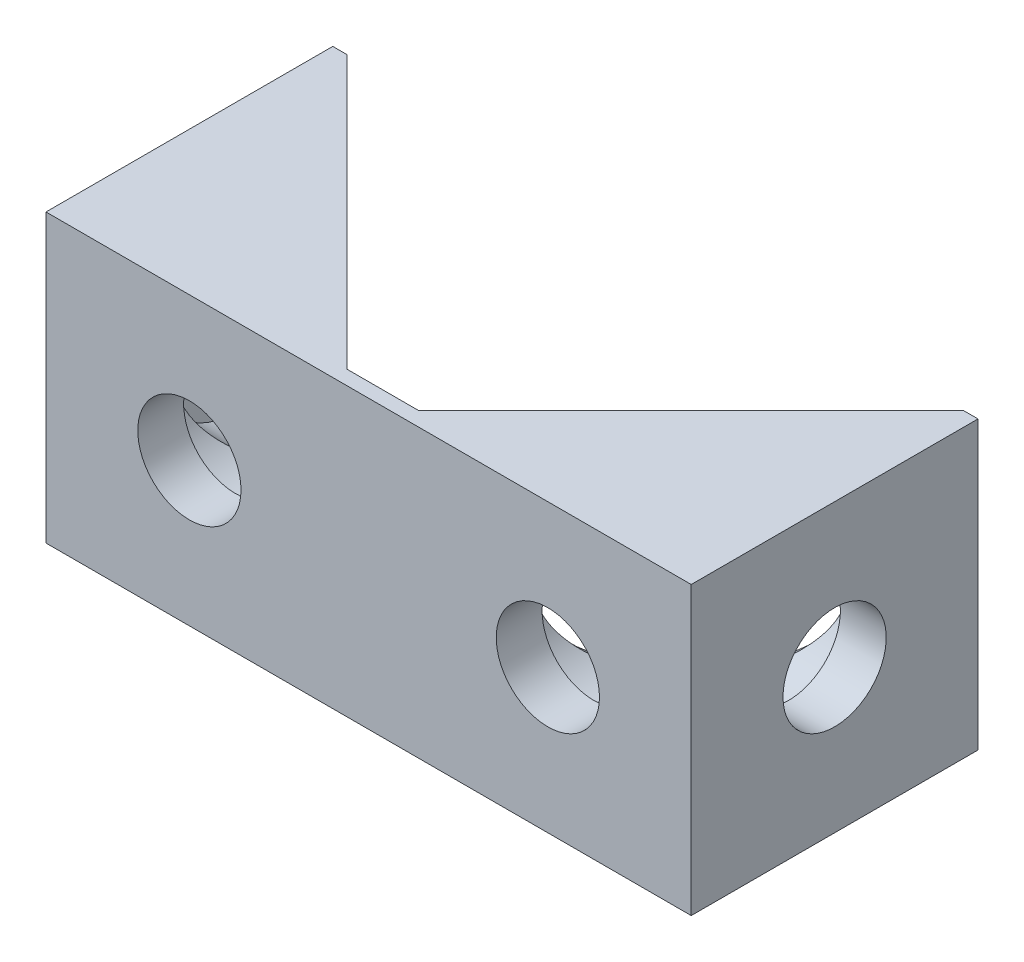
ISO-10303-21;
HEADER;
FILE_DESCRIPTION(('STEP AP214'),'2;1');
FILE_NAME('part.step','',(''),(''),'','','');
FILE_SCHEMA(('AUTOMOTIVE_DESIGN { 1 0 10303 214 1 1 1 1 }'));
ENDSEC;
DATA;
#1=APPLICATION_CONTEXT('core data for automotive mechanical design processes');
#2=APPLICATION_PROTOCOL_DEFINITION('international standard','automotive_design',2000,#1);
#3=PRODUCT_CONTEXT('',#1,'mechanical');
#4=PRODUCT('Part','Part','',(#3));
#5=PRODUCT_RELATED_PRODUCT_CATEGORY('part','',(#4));
#6=PRODUCT_DEFINITION_FORMATION('','',#4);
#7=PRODUCT_DEFINITION_CONTEXT('part definition',#1,'design');
#8=PRODUCT_DEFINITION('design','',#6,#7);
#9=PRODUCT_DEFINITION_SHAPE('','',#8);
#10=(LENGTH_UNIT() NAMED_UNIT(*) SI_UNIT(.MILLI.,.METRE.));
#11=(NAMED_UNIT(*) PLANE_ANGLE_UNIT() SI_UNIT($,.RADIAN.));
#12=(NAMED_UNIT(*) SI_UNIT($,.STERADIAN.) SOLID_ANGLE_UNIT());
#13=UNCERTAINTY_MEASURE_WITH_UNIT(LENGTH_MEASURE(1.E-05),#10,'distance_accuracy_value','');
#14=(GEOMETRIC_REPRESENTATION_CONTEXT(3) GLOBAL_UNCERTAINTY_ASSIGNED_CONTEXT((#13)) GLOBAL_UNIT_ASSIGNED_CONTEXT((#10,
#11,#12)) REPRESENTATION_CONTEXT('',''));
#15=CARTESIAN_POINT('',(0.,0.,0.));
#16=DIRECTION('',(0.,0.,1.));
#17=DIRECTION('',(1.,0.,0.));
#18=AXIS2_PLACEMENT_3D('',#15,#16,#17);
#19=CARTESIAN_POINT('',(35.,0.,-35.556349186104));
#20=DIRECTION('',(0.,0.,1.));
#21=DIRECTION('',(1.,0.,0.));
#22=AXIS2_PLACEMENT_3D('',#19,#20,#21);
#23=CYLINDRICAL_SURFACE('',#22,5.5);
#24=CARTESIAN_POINT('',(35.,0.,-3.2));
#25=DIRECTION('',(0.,0.,1.));
#26=DIRECTION('',(-1.,0.,0.));
#27=AXIS2_PLACEMENT_3D('',#24,#25,#26);
#28=CIRCLE('',#27,5.5);
#29=CARTESIAN_POINT('',(29.5,0.,-3.2));
#30=VERTEX_POINT('',#29);
#31=EDGE_CURVE('E218',#30,#30,#28,.T.);
#32=ORIENTED_EDGE('',*,*,#31,.T.);
#33=EDGE_LOOP('',(#32));
#34=FACE_BOUND('',#33,.T.);
#35=CARTESIAN_POINT('',(35.,0.,-10.));
#36=DIRECTION('',(0.707106781186547,0.,0.707106781186547));
#37=DIRECTION('',(-0.707106781186547,0.,0.707106781186547));
#38=AXIS2_PLACEMENT_3D('',#35,#36,#37);
#39=ELLIPSE('',#38,7.77817459305202,5.5);
#40=CARTESIAN_POINT('',(35.,-5.5,-10.));
#41=VERTEX_POINT('',#40);
#42=CARTESIAN_POINT('',(35.,5.5,-10.));
#43=VERTEX_POINT('',#42);
#44=EDGE_CURVE('E56',#41,#43,#39,.F.);
#45=ORIENTED_EDGE('',*,*,#44,.T.);
#46=CARTESIAN_POINT('',(35.,0.,-10.));
#47=DIRECTION('',(-0.707106781186547,0.,0.707106781186547));
#48=DIRECTION('',(0.707106781186547,0.,0.707106781186547));
#49=AXIS2_PLACEMENT_3D('',#46,#47,#48);
#50=ELLIPSE('',#49,7.77817459305202,5.5);
#51=EDGE_CURVE('E235',#43,#41,#50,.F.);
#52=ORIENTED_EDGE('',*,*,#51,.T.);
#53=EDGE_LOOP('',(#45,#52));
#54=FACE_BOUND('',#53,.T.);
#55=ADVANCED_FACE('F42',(#34,#54),#23,.F.);
#56=CARTESIAN_POINT('',(10.,0.,-35.556349186104));
#57=DIRECTION('',(0.,0.,1.));
#58=DIRECTION('',(1.,0.,0.));
#59=AXIS2_PLACEMENT_3D('',#56,#57,#58);
#60=CYLINDRICAL_SURFACE('',#59,5.5);
#61=CARTESIAN_POINT('',(10.,0.,-3.2));
#62=DIRECTION('',(0.,0.,1.));
#63=DIRECTION('',(1.,0.,0.));
#64=AXIS2_PLACEMENT_3D('',#61,#62,#63);
#65=CIRCLE('',#64,5.5);
#66=CARTESIAN_POINT('',(15.5,0.,-3.2));
#67=VERTEX_POINT('',#66);
#68=EDGE_CURVE('E156',#67,#67,#65,.T.);
#69=ORIENTED_EDGE('',*,*,#68,.T.);
#70=EDGE_LOOP('',(#69));
#71=FACE_BOUND('',#70,.T.);
#72=CARTESIAN_POINT('',(10.,0.,-10.));
#73=DIRECTION('',(0.707106781186547,0.,0.707106781186547));
#74=DIRECTION('',(-0.707106781186547,0.,0.707106781186547));
#75=AXIS2_PLACEMENT_3D('',#72,#73,#74);
#76=ELLIPSE('',#75,7.77817459305202,5.5);
#77=CARTESIAN_POINT('',(10.,-5.5,-10.));
#78=VERTEX_POINT('',#77);
#79=CARTESIAN_POINT('',(10.,5.5,-10.));
#80=VERTEX_POINT('',#79);
#81=EDGE_CURVE('E62',#78,#80,#76,.F.);
#82=ORIENTED_EDGE('',*,*,#81,.T.);
#83=CARTESIAN_POINT('',(10.,0.,-10.));
#84=DIRECTION('',(-0.707106781186547,0.,0.707106781186547));
#85=DIRECTION('',(0.707106781186547,0.,0.707106781186547));
#86=AXIS2_PLACEMENT_3D('',#83,#84,#85);
#87=ELLIPSE('',#86,7.77817459305202,5.5);
#88=EDGE_CURVE('E12',#80,#78,#87,.F.);
#89=ORIENTED_EDGE('',*,*,#88,.T.);
#90=EDGE_LOOP('',(#82,#89));
#91=FACE_BOUND('',#90,.T.);
#92=ADVANCED_FACE('F147',(#71,#91),#60,.F.);
#93=CARTESIAN_POINT('',(55.1823376490863,0.,-10.));
#94=DIRECTION('',(-1.,0.,0.));
#95=DIRECTION('',(0.,0.,1.));
#96=AXIS2_PLACEMENT_3D('',#93,#94,#95);
#97=CYLINDRICAL_SURFACE('',#96,3.6);
#98=CARTESIAN_POINT('',(45.,0.,-10.));
#99=DIRECTION('',(-1.,0.,0.));
#100=DIRECTION('',(0.,0.,1.));
#101=AXIS2_PLACEMENT_3D('',#98,#99,#100);
#102=CIRCLE('',#101,3.6);
#103=CARTESIAN_POINT('',(45.,0.,-6.4));
#104=VERTEX_POINT('',#103);
#105=EDGE_CURVE('E225',#104,#104,#102,.F.);
#106=CARTESIAN_POINT('',(41.8,0.,-10.));
#107=DIRECTION('',(-1.,0.,0.));
#108=DIRECTION('',(0.,0.,1.));
#109=AXIS2_PLACEMENT_3D('',#106,#107,#108);
#110=CIRCLE('',#109,3.6);
#111=CARTESIAN_POINT('',(41.8,0.,-6.4));
#112=VERTEX_POINT('',#111);
#113=EDGE_CURVE('E249',#112,#112,#110,.F.);
#114=CARTESIAN_POINT('',(45.,0.,-6.4));
#115=CARTESIAN_POINT('',(44.9666666666667,0.,-6.4));
#116=CARTESIAN_POINT('',(44.9333333333334,0.,-6.4));
#117=CARTESIAN_POINT('',(44.8666666666667,0.,-6.4));
#118=CARTESIAN_POINT('',(44.8333333333333,0.,-6.4));
#119=CARTESIAN_POINT('',(44.7666666666667,0.,-6.4));
#120=CARTESIAN_POINT('',(44.7333333333334,0.,-6.4));
#121=CARTESIAN_POINT('',(44.6666666666667,0.,-6.4));
#122=CARTESIAN_POINT('',(44.6333333333334,0.,-6.4));
#123=CARTESIAN_POINT('',(44.5666666666667,0.,-6.4));
#124=CARTESIAN_POINT('',(44.5333333333333,0.,-6.4));
#125=CARTESIAN_POINT('',(44.4666666666667,0.,-6.4));
#126=CARTESIAN_POINT('',(44.4333333333334,0.,-6.4));
#127=CARTESIAN_POINT('',(44.3666666666667,0.,-6.4));
#128=CARTESIAN_POINT('',(44.3333333333333,0.,-6.4));
#129=CARTESIAN_POINT('',(44.2666666666667,0.,-6.4));
#130=CARTESIAN_POINT('',(44.2333333333333,0.,-6.4));
#131=CARTESIAN_POINT('',(44.1666666666667,0.,-6.4));
#132=CARTESIAN_POINT('',(44.1333333333334,0.,-6.4));
#133=CARTESIAN_POINT('',(44.0666666666667,0.,-6.4));
#134=CARTESIAN_POINT('',(44.0333333333333,0.,-6.4));
#135=CARTESIAN_POINT('',(43.9666666666667,0.,-6.4));
#136=CARTESIAN_POINT('',(43.9333333333333,0.,-6.4));
#137=CARTESIAN_POINT('',(43.8666666666667,0.,-6.4));
#138=CARTESIAN_POINT('',(43.8333333333333,0.,-6.4));
#139=CARTESIAN_POINT('',(43.7666666666667,0.,-6.4));
#140=CARTESIAN_POINT('',(43.7333333333333,0.,-6.4));
#141=CARTESIAN_POINT('',(43.6666666666667,0.,-6.4));
#142=CARTESIAN_POINT('',(43.6333333333333,0.,-6.4));
#143=CARTESIAN_POINT('',(43.5666666666667,0.,-6.4));
#144=CARTESIAN_POINT('',(43.5333333333333,0.,-6.4));
#145=CARTESIAN_POINT('',(43.4666666666667,0.,-6.4));
#146=CARTESIAN_POINT('',(43.4333333333333,0.,-6.4));
#147=CARTESIAN_POINT('',(43.3666666666667,0.,-6.4));
#148=CARTESIAN_POINT('',(43.3333333333333,0.,-6.4));
#149=CARTESIAN_POINT('',(43.2666666666667,0.,-6.4));
#150=CARTESIAN_POINT('',(43.2333333333333,0.,-6.4));
#151=CARTESIAN_POINT('',(43.1666666666667,0.,-6.4));
#152=CARTESIAN_POINT('',(43.1333333333333,0.,-6.4));
#153=CARTESIAN_POINT('',(43.0666666666667,0.,-6.4));
#154=CARTESIAN_POINT('',(43.0333333333333,0.,-6.4));
#155=CARTESIAN_POINT('',(42.9666666666667,0.,-6.4));
#156=CARTESIAN_POINT('',(42.9333333333333,0.,-6.4));
#157=CARTESIAN_POINT('',(42.8666666666667,0.,-6.4));
#158=CARTESIAN_POINT('',(42.8333333333333,0.,-6.4));
#159=CARTESIAN_POINT('',(42.7666666666667,0.,-6.4));
#160=CARTESIAN_POINT('',(42.7333333333333,0.,-6.4));
#161=CARTESIAN_POINT('',(42.6666666666667,0.,-6.4));
#162=CARTESIAN_POINT('',(42.6333333333333,0.,-6.4));
#163=CARTESIAN_POINT('',(42.5666666666667,0.,-6.4));
#164=CARTESIAN_POINT('',(42.5333333333333,0.,-6.4));
#165=CARTESIAN_POINT('',(42.4666666666667,0.,-6.4));
#166=CARTESIAN_POINT('',(42.4333333333333,0.,-6.4));
#167=CARTESIAN_POINT('',(42.3666666666667,0.,-6.4));
#168=CARTESIAN_POINT('',(42.3333333333333,0.,-6.4));
#169=CARTESIAN_POINT('',(42.2666666666667,0.,-6.4));
#170=CARTESIAN_POINT('',(42.2333333333333,0.,-6.4));
#171=CARTESIAN_POINT('',(42.1666666666667,0.,-6.4));
#172=CARTESIAN_POINT('',(42.1333333333333,0.,-6.4));
#173=CARTESIAN_POINT('',(42.0666666666667,0.,-6.4));
#174=CARTESIAN_POINT('',(42.0333333333333,0.,-6.4));
#175=CARTESIAN_POINT('',(41.9666666666667,0.,-6.4));
#176=CARTESIAN_POINT('',(41.9333333333333,0.,-6.4));
#177=CARTESIAN_POINT('',(41.8666666666667,0.,-6.4));
#178=CARTESIAN_POINT('',(41.8333333333333,0.,-6.4));
#179=CARTESIAN_POINT('',(41.8,0.,-6.4));
#180=B_SPLINE_CURVE_WITH_KNOTS('',3,(#114,#115,#116,#117,#118,#119,#120,#121,#122,#123,#124,
#125,#126,#127,#128,#129,#130,#131,#132,#133,#134,#135,#136,#137,#138,#139,#140,#141,#142,#143,
#144,#145,#146,#147,#148,#149,#150,#151,#152,#153,#154,#155,#156,#157,#158,#159,#160,#161,#162,
#163,#164,#165,#166,#167,#168,#169,#170,#171,#172,#173,#174,#175,#176,#177,#178,#179),
.UNSPECIFIED.,.F.,.F.,(4,2,2,2,2,2,2,2,2,2,2,2,2,2,2,2,2,2,2,2,2,2,2,2,2,2,2,2,2,2,2,2,4),(0.,
0.100000000000003,0.199999999999999,0.300000000000002,0.400000000000005,0.5,0.600000000000003,
0.700000000000006,0.800000000000002,0.900000000000005,1.00000000000001,1.1,1.20000000000001,1.3,
1.40000000000001,1.50000000000001,1.6,1.70000000000001,1.8,1.90000000000001,2.00000000000001,
2.1,2.20000000000001,2.30000000000001,2.40000000000001,2.50000000000001,2.60000000000001,
2.70000000000001,2.80000000000001,2.90000000000001,3.00000000000001,3.10000000000001,
3.20000000000001),.UNSPECIFIED.);
#181=EDGE_CURVE('BSEAM272',#104,#112,#180,.T.);
#182=ORIENTED_EDGE('',*,*,#105,.T.);
#183=ORIENTED_EDGE('',*,*,#113,.F.);
#184=ORIENTED_EDGE('',*,*,#181,.T.);
#185=ORIENTED_EDGE('',*,*,#181,.F.);
#186=EDGE_LOOP('',(#182,#184,#183,#185));
#187=FACE_BOUND('',#186,.T.);
#188=ADVANCED_FACE('F272',(#187),#97,.F.);
#189=CARTESIAN_POINT('',(35.,0.,-30.1823376490863));
#190=DIRECTION('',(0.,0.,1.));
#191=DIRECTION('',(1.,0.,0.));
#192=AXIS2_PLACEMENT_3D('',#189,#190,#191);
#193=CYLINDRICAL_SURFACE('',#192,3.6);
#194=CARTESIAN_POINT('',(35.,0.,0.));
#195=DIRECTION('',(0.,0.,-1.));
#196=DIRECTION('',(-1.,0.,0.));
#197=AXIS2_PLACEMENT_3D('',#194,#195,#196);
#198=CIRCLE('',#197,3.6);
#199=CARTESIAN_POINT('',(38.6,0.,0.));
#200=VERTEX_POINT('',#199);
#201=EDGE_CURVE('E153',#200,#200,#198,.T.);
#202=CARTESIAN_POINT('',(35.,0.,-3.2));
#203=DIRECTION('',(0.,0.,1.));
#204=DIRECTION('',(-1.,0.,0.));
#205=AXIS2_PLACEMENT_3D('',#202,#203,#204);
#206=CIRCLE('',#205,3.6);
#207=CARTESIAN_POINT('',(38.6,0.,-3.2));
#208=VERTEX_POINT('',#207);
#209=EDGE_CURVE('E222',#208,#208,#206,.T.);
#210=CARTESIAN_POINT('',(38.6,0.,0.));
#211=CARTESIAN_POINT('',(38.6,0.,-0.0333333333333297));
#212=CARTESIAN_POINT('',(38.6,0.,-0.0666666666666628));
#213=CARTESIAN_POINT('',(38.6,0.,-0.133333333333329));
#214=CARTESIAN_POINT('',(38.6,0.,-0.166666666666662));
#215=CARTESIAN_POINT('',(38.6,0.,-0.23333333333333));
#216=CARTESIAN_POINT('',(38.6,0.,-0.266666666666664));
#217=CARTESIAN_POINT('',(38.6,0.,-0.333333333333331));
#218=CARTESIAN_POINT('',(38.6,0.,-0.366666666666664));
#219=CARTESIAN_POINT('',(38.6,0.,-0.433333333333331));
#220=CARTESIAN_POINT('',(38.6,0.,-0.466666666666664));
#221=CARTESIAN_POINT('',(38.6,0.,-0.53333333333333));
#222=CARTESIAN_POINT('',(38.6,0.,-0.566666666666663));
#223=CARTESIAN_POINT('',(38.6,0.,-0.63333333333333));
#224=CARTESIAN_POINT('',(38.6,0.,-0.666666666666663));
#225=CARTESIAN_POINT('',(38.6,0.,-0.73333333333333));
#226=CARTESIAN_POINT('',(38.6,0.,-0.766666666666664));
#227=CARTESIAN_POINT('',(38.6,0.,-0.833333333333332));
#228=CARTESIAN_POINT('',(38.6,0.,-0.866666666666665));
#229=CARTESIAN_POINT('',(38.6,0.,-0.933333333333331));
#230=CARTESIAN_POINT('',(38.6,0.,-0.966666666666664));
#231=CARTESIAN_POINT('',(38.6,0.,-1.03333333333333));
#232=CARTESIAN_POINT('',(38.6,0.,-1.06666666666666));
#233=CARTESIAN_POINT('',(38.6,0.,-1.13333333333333));
#234=CARTESIAN_POINT('',(38.6,0.,-1.16666666666666));
#235=CARTESIAN_POINT('',(38.6,0.,-1.23333333333333));
#236=CARTESIAN_POINT('',(38.6,0.,-1.26666666666666));
#237=CARTESIAN_POINT('',(38.6,0.,-1.33333333333333));
#238=CARTESIAN_POINT('',(38.6,0.,-1.36666666666666));
#239=CARTESIAN_POINT('',(38.6,0.,-1.43333333333333));
#240=CARTESIAN_POINT('',(38.6,0.,-1.46666666666666));
#241=CARTESIAN_POINT('',(38.6,0.,-1.53333333333333));
#242=CARTESIAN_POINT('',(38.6,0.,-1.56666666666666));
#243=CARTESIAN_POINT('',(38.6,0.,-1.63333333333333));
#244=CARTESIAN_POINT('',(38.6,0.,-1.66666666666666));
#245=CARTESIAN_POINT('',(38.6,0.,-1.73333333333333));
#246=CARTESIAN_POINT('',(38.6,0.,-1.76666666666666));
#247=CARTESIAN_POINT('',(38.6,0.,-1.83333333333333));
#248=CARTESIAN_POINT('',(38.6,0.,-1.86666666666666));
#249=CARTESIAN_POINT('',(38.6,0.,-1.93333333333333));
#250=CARTESIAN_POINT('',(38.6,0.,-1.96666666666667));
#251=CARTESIAN_POINT('',(38.6,0.,-2.03333333333333));
#252=CARTESIAN_POINT('',(38.6,0.,-2.06666666666666));
#253=CARTESIAN_POINT('',(38.6,0.,-2.13333333333333));
#254=CARTESIAN_POINT('',(38.6,0.,-2.16666666666666));
#255=CARTESIAN_POINT('',(38.6,0.,-2.23333333333333));
#256=CARTESIAN_POINT('',(38.6,0.,-2.26666666666666));
#257=CARTESIAN_POINT('',(38.6,0.,-2.33333333333333));
#258=CARTESIAN_POINT('',(38.6,0.,-2.36666666666666));
#259=CARTESIAN_POINT('',(38.6,0.,-2.43333333333333));
#260=CARTESIAN_POINT('',(38.6,0.,-2.46666666666666));
#261=CARTESIAN_POINT('',(38.6,0.,-2.53333333333333));
#262=CARTESIAN_POINT('',(38.6,0.,-2.56666666666667));
#263=CARTESIAN_POINT('',(38.6,0.,-2.63333333333333));
#264=CARTESIAN_POINT('',(38.6,0.,-2.66666666666666));
#265=CARTESIAN_POINT('',(38.6,0.,-2.73333333333333));
#266=CARTESIAN_POINT('',(38.6,0.,-2.76666666666666));
#267=CARTESIAN_POINT('',(38.6,0.,-2.83333333333333));
#268=CARTESIAN_POINT('',(38.6,0.,-2.86666666666666));
#269=CARTESIAN_POINT('',(38.6,0.,-2.93333333333333));
#270=CARTESIAN_POINT('',(38.6,0.,-2.96666666666666));
#271=CARTESIAN_POINT('',(38.6,0.,-3.03333333333333));
#272=CARTESIAN_POINT('',(38.6,0.,-3.06666666666667));
#273=CARTESIAN_POINT('',(38.6,0.,-3.13333333333333));
#274=CARTESIAN_POINT('',(38.6,0.,-3.16666666666666));
#275=CARTESIAN_POINT('',(38.6,0.,-3.2));
#276=B_SPLINE_CURVE_WITH_KNOTS('',3,(#210,#211,#212,#213,#214,#215,#216,#217,#218,#219,#220,
#221,#222,#223,#224,#225,#226,#227,#228,#229,#230,#231,#232,#233,#234,#235,#236,#237,#238,#239,
#240,#241,#242,#243,#244,#245,#246,#247,#248,#249,#250,#251,#252,#253,#254,#255,#256,#257,#258,
#259,#260,#261,#262,#263,#264,#265,#266,#267,#268,#269,#270,#271,#272,#273,#274,#275),
.UNSPECIFIED.,.F.,.F.,(4,2,2,2,2,2,2,2,2,2,2,2,2,2,2,2,2,2,2,2,2,2,2,2,2,2,2,2,2,2,2,2,4),(0.,
0.0999999999999994,0.199999999999999,0.300000000000002,0.400000000000001,0.5,0.6,
0.699999999999999,0.800000000000002,0.900000000000001,1.,1.1,1.2,1.3,1.4,1.5,1.6,1.7,1.8,1.9,2.,
2.1,2.2,2.3,2.4,2.5,2.6,2.7,2.8,2.9,3.,3.1,3.2),.UNSPECIFIED.);
#277=EDGE_CURVE('BSEAM274',#200,#208,#276,.T.);
#278=ORIENTED_EDGE('',*,*,#201,.F.);
#279=ORIENTED_EDGE('',*,*,#209,.F.);
#280=ORIENTED_EDGE('',*,*,#277,.T.);
#281=ORIENTED_EDGE('',*,*,#277,.F.);
#282=EDGE_LOOP('',(#278,#280,#279,#281));
#283=FACE_BOUND('',#282,.T.);
#284=ADVANCED_FACE('F274',(#283),#193,.F.);
#285=CARTESIAN_POINT('',(25.,10.,0.));
#286=DIRECTION('',(0.,0.,-1.));
#287=DIRECTION('',(-1.,0.,0.));
#288=AXIS2_PLACEMENT_3D('',#285,#286,#287);
#289=PLANE('',#288);
#290=DIRECTION('',(1.,0.,0.));
#291=VECTOR('',#290,1.);
#292=CARTESIAN_POINT('',(25.,-10.,0.));
#293=LINE('',#292,#291);
#294=CARTESIAN_POINT('',(0.,-10.,0.));
#295=VERTEX_POINT('',#294);
#296=CARTESIAN_POINT('',(45.,-10.,0.));
#297=VERTEX_POINT('',#296);
#298=EDGE_CURVE('E197',#295,#297,#293,.T.);
#299=ORIENTED_EDGE('',*,*,#298,.T.);
#300=DIRECTION('',(0.,-1.,0.));
#301=VECTOR('',#300,1.);
#302=CARTESIAN_POINT('',(45.,10.,0.));
#303=LINE('',#302,#301);
#304=CARTESIAN_POINT('',(45.,10.,0.));
#305=VERTEX_POINT('',#304);
#306=EDGE_CURVE('E145',#305,#297,#303,.T.);
#307=ORIENTED_EDGE('',*,*,#306,.F.);
#308=DIRECTION('',(1.,0.,0.));
#309=VECTOR('',#308,1.);
#310=CARTESIAN_POINT('',(20.,10.,0.));
#311=LINE('',#310,#309);
#312=CARTESIAN_POINT('',(0.,10.,0.));
#313=VERTEX_POINT('',#312);
#314=EDGE_CURVE('E184',#313,#305,#311,.T.);
#315=ORIENTED_EDGE('',*,*,#314,.F.);
#316=DIRECTION('',(0.,-1.,0.));
#317=VECTOR('',#316,1.);
#318=CARTESIAN_POINT('',(0.,10.,0.));
#319=LINE('',#318,#317);
#320=EDGE_CURVE('E177',#313,#295,#319,.T.);
#321=ORIENTED_EDGE('',*,*,#320,.T.);
#322=EDGE_LOOP('',(#299,#307,#315,#321));
#323=FACE_BOUND('',#322,.T.);
#324=ORIENTED_EDGE('',*,*,#201,.T.);
#325=EDGE_LOOP('',(#324));
#326=FACE_BOUND('',#325,.T.);
#327=CARTESIAN_POINT('',(10.,0.,0.));
#328=DIRECTION('',(0.,0.,1.));
#329=DIRECTION('',(1.,0.,0.));
#330=AXIS2_PLACEMENT_3D('',#327,#328,#329);
#331=CIRCLE('',#330,3.6);
#332=CARTESIAN_POINT('',(13.6,0.,0.));
#333=VERTEX_POINT('',#332);
#334=EDGE_CURVE('E199',#333,#333,#331,.T.);
#335=ORIENTED_EDGE('',*,*,#334,.F.);
#336=EDGE_LOOP('',(#335));
#337=FACE_BOUND('',#336,.T.);
#338=ADVANCED_FACE('F44',(#323,#326,#337),#289,.F.);
#339=CARTESIAN_POINT('',(45.,10.,0.));
#340=DIRECTION('',(-1.,0.,0.));
#341=DIRECTION('',(0.,0.,1.));
#342=AXIS2_PLACEMENT_3D('',#339,#340,#341);
#343=PLANE('',#342);
#344=ORIENTED_EDGE('',*,*,#105,.F.);
#345=EDGE_LOOP('',(#344));
#346=FACE_BOUND('',#345,.T.);
#347=DIRECTION('',(0.,0.,-1.));
#348=VECTOR('',#347,1.);
#349=CARTESIAN_POINT('',(45.,-10.,0.));
#350=LINE('',#349,#348);
#351=CARTESIAN_POINT('',(45.,-10.,-20.));
#352=VERTEX_POINT('',#351);
#353=EDGE_CURVE('E195',#297,#352,#350,.T.);
#354=ORIENTED_EDGE('',*,*,#353,.T.);
#355=DIRECTION('',(0.,-1.,0.));
#356=VECTOR('',#355,1.);
#357=CARTESIAN_POINT('',(45.,10.,-20.));
#358=LINE('',#357,#356);
#359=CARTESIAN_POINT('',(45.,10.,-20.));
#360=VERTEX_POINT('',#359);
#361=EDGE_CURVE('E159',#360,#352,#358,.T.);
#362=ORIENTED_EDGE('',*,*,#361,.F.);
#363=DIRECTION('',(0.,0.,-1.));
#364=VECTOR('',#363,1.);
#365=CARTESIAN_POINT('',(45.,10.,0.));
#366=LINE('',#365,#364);
#367=EDGE_CURVE('E211',#305,#360,#366,.T.);
#368=ORIENTED_EDGE('',*,*,#367,.F.);
#369=ORIENTED_EDGE('',*,*,#306,.T.);
#370=EDGE_LOOP('',(#354,#362,#368,#369));
#371=FACE_BOUND('',#370,.T.);
#372=ADVANCED_FACE('F355',(#346,#371),#343,.F.);
#373=CARTESIAN_POINT('',(45.,10.,-20.));
#374=DIRECTION('',(0.,0.,1.));
#375=DIRECTION('',(1.,0.,0.));
#376=AXIS2_PLACEMENT_3D('',#373,#374,#375);
#377=PLANE('',#376);
#378=DIRECTION('',(-1.,0.,0.));
#379=VECTOR('',#378,1.);
#380=CARTESIAN_POINT('',(45.,-10.,-20.));
#381=LINE('',#380,#379);
#382=CARTESIAN_POINT('',(44.,-10.,-20.));
#383=VERTEX_POINT('',#382);
#384=EDGE_CURVE('E193',#352,#383,#381,.T.);
#385=ORIENTED_EDGE('',*,*,#384,.T.);
#386=DIRECTION('',(0.,-1.,0.));
#387=VECTOR('',#386,1.);
#388=CARTESIAN_POINT('',(44.,10.,-20.));
#389=LINE('',#388,#387);
#390=CARTESIAN_POINT('',(44.,10.,-20.));
#391=VERTEX_POINT('',#390);
#392=EDGE_CURVE('E162',#391,#383,#389,.T.);
#393=ORIENTED_EDGE('',*,*,#392,.F.);
#394=DIRECTION('',(-1.,0.,0.));
#395=VECTOR('',#394,1.);
#396=CARTESIAN_POINT('',(45.,10.,-20.));
#397=LINE('',#396,#395);
#398=EDGE_CURVE('E209',#360,#391,#397,.T.);
#399=ORIENTED_EDGE('',*,*,#398,.F.);
#400=ORIENTED_EDGE('',*,*,#361,.T.);
#401=EDGE_LOOP('',(#385,#393,#399,#400));
#402=FACE_BOUND('',#401,.T.);
#403=ADVANCED_FACE('F322',(#402),#377,.F.);
#404=CARTESIAN_POINT('',(44.,10.,-20.));
#405=DIRECTION('',(0.707106781186547,0.,0.707106781186548));
#406=DIRECTION('',(0.707106781186548,0.,-0.707106781186547));
#407=AXIS2_PLACEMENT_3D('',#404,#405,#406);
#408=PLANE('',#407);
#409=CARTESIAN_POINT('',(35.,0.,-11.));
#410=DIRECTION('',(0.707106781186547,0.,0.707106781186548));
#411=DIRECTION('',(-0.707106781186548,0.,0.707106781186547));
#412=AXIS2_PLACEMENT_3D('',#409,#410,#411);
#413=ELLIPSE('',#412,7.77817459305202,5.5);
#414=CARTESIAN_POINT('',(34.5,-5.47722557505166,-10.5));
#415=VERTEX_POINT('',#414);
#416=CARTESIAN_POINT('',(34.5,5.47722557505166,-10.5));
#417=VERTEX_POINT('',#416);
#418=EDGE_CURVE('E150',#415,#417,#413,.T.);
#419=ORIENTED_EDGE('',*,*,#418,.T.);
#420=CARTESIAN_POINT('',(34.,0.,-10.));
#421=DIRECTION('',(0.707106781186547,0.,0.707106781186548));
#422=DIRECTION('',(-0.707106781186548,0.,0.707106781186547));
#423=AXIS2_PLACEMENT_3D('',#420,#421,#422);
#424=ELLIPSE('',#423,7.77817459305202,5.5);
#425=EDGE_CURVE('E237',#417,#415,#424,.T.);
#426=ORIENTED_EDGE('',*,*,#425,.T.);
#427=EDGE_LOOP('',(#419,#426));
#428=FACE_BOUND('',#427,.T.);
#429=DIRECTION('',(-0.707106781186548,0.,0.707106781186547));
#430=VECTOR('',#429,1.);
#431=CARTESIAN_POINT('',(44.,-10.,-20.));
#432=LINE('',#431,#430);
#433=CARTESIAN_POINT('',(25.,-10.,-1.));
#434=VERTEX_POINT('',#433);
#435=EDGE_CURVE('E191',#383,#434,#432,.T.);
#436=ORIENTED_EDGE('',*,*,#435,.T.);
#437=DIRECTION('',(0.,-1.,0.));
#438=VECTOR('',#437,1.);
#439=CARTESIAN_POINT('',(25.,10.,-1.));
#440=LINE('',#439,#438);
#441=CARTESIAN_POINT('',(25.,10.,-1.));
#442=VERTEX_POINT('',#441);
#443=EDGE_CURVE('E165',#442,#434,#440,.T.);
#444=ORIENTED_EDGE('',*,*,#443,.F.);
#445=DIRECTION('',(-0.707106781186548,0.,0.707106781186547));
#446=VECTOR('',#445,1.);
#447=CARTESIAN_POINT('',(44.,10.,-20.));
#448=LINE('',#447,#446);
#449=EDGE_CURVE('E207',#391,#442,#448,.T.);
#450=ORIENTED_EDGE('',*,*,#449,.F.);
#451=ORIENTED_EDGE('',*,*,#392,.T.);
#452=EDGE_LOOP('',(#436,#444,#450,#451));
#453=FACE_BOUND('',#452,.T.);
#454=ADVANCED_FACE('F319',(#428,#453),#408,.F.);
#455=CARTESIAN_POINT('',(20.,10.,-1.));
#456=DIRECTION('',(0.,0.,1.));
#457=DIRECTION('',(1.,0.,0.));
#458=AXIS2_PLACEMENT_3D('',#455,#456,#457);
#459=PLANE('',#458);
#460=DIRECTION('',(-1.,0.,0.));
#461=VECTOR('',#460,1.);
#462=CARTESIAN_POINT('',(20.,-10.,-1.));
#463=LINE('',#462,#461);
#464=CARTESIAN_POINT('',(20.,-10.,-1.));
#465=VERTEX_POINT('',#464);
#466=EDGE_CURVE('E189',#434,#465,#463,.T.);
#467=ORIENTED_EDGE('',*,*,#466,.T.);
#468=DIRECTION('',(0.,-1.,0.));
#469=VECTOR('',#468,1.);
#470=CARTESIAN_POINT('',(20.,10.,-1.));
#471=LINE('',#470,#469);
#472=CARTESIAN_POINT('',(20.,10.,-1.));
#473=VERTEX_POINT('',#472);
#474=EDGE_CURVE('E168',#473,#465,#471,.T.);
#475=ORIENTED_EDGE('',*,*,#474,.F.);
#476=DIRECTION('',(-1.,0.,0.));
#477=VECTOR('',#476,1.);
#478=CARTESIAN_POINT('',(20.,10.,-1.));
#479=LINE('',#478,#477);
#480=EDGE_CURVE('E205',#442,#473,#479,.T.);
#481=ORIENTED_EDGE('',*,*,#480,.F.);
#482=ORIENTED_EDGE('',*,*,#443,.T.);
#483=EDGE_LOOP('',(#467,#475,#481,#482));
#484=FACE_BOUND('',#483,.T.);
#485=ADVANCED_FACE('F321',(#484),#459,.F.);
#486=CARTESIAN_POINT('',(1.,10.,-20.));
#487=DIRECTION('',(-0.707106781186548,0.,0.707106781186548));
#488=DIRECTION('',(0.707106781186548,0.,0.707106781186548));
#489=AXIS2_PLACEMENT_3D('',#486,#487,#488);
#490=PLANE('',#489);
#491=CARTESIAN_POINT('',(10.,0.,-11.));
#492=DIRECTION('',(-0.707106781186548,0.,0.707106781186548));
#493=DIRECTION('',(0.707106781186548,0.,0.707106781186548));
#494=AXIS2_PLACEMENT_3D('',#491,#492,#493);
#495=ELLIPSE('',#494,7.77817459305202,5.5);
#496=CARTESIAN_POINT('',(10.5,5.47722557505166,-10.5));
#497=VERTEX_POINT('',#496);
#498=CARTESIAN_POINT('',(10.5,-5.47722557505166,-10.5));
#499=VERTEX_POINT('',#498);
#500=EDGE_CURVE('E154',#497,#499,#495,.T.);
#501=ORIENTED_EDGE('',*,*,#500,.T.);
#502=CARTESIAN_POINT('',(11.,0.,-10.));
#503=DIRECTION('',(-0.707106781186548,0.,0.707106781186548));
#504=DIRECTION('',(-0.707106781186548,0.,-0.707106781186548));
#505=AXIS2_PLACEMENT_3D('',#502,#503,#504);
#506=ELLIPSE('',#505,7.77817459305202,5.5);
#507=EDGE_CURVE('E136',#499,#497,#506,.T.);
#508=ORIENTED_EDGE('',*,*,#507,.T.);
#509=EDGE_LOOP('',(#501,#508));
#510=FACE_BOUND('',#509,.T.);
#511=DIRECTION('',(-0.707106781186548,0.,-0.707106781186548));
#512=VECTOR('',#511,1.);
#513=CARTESIAN_POINT('',(1.,-10.,-20.));
#514=LINE('',#513,#512);
#515=CARTESIAN_POINT('',(1.,-10.,-20.));
#516=VERTEX_POINT('',#515);
#517=EDGE_CURVE('E187',#465,#516,#514,.T.);
#518=ORIENTED_EDGE('',*,*,#517,.T.);
#519=DIRECTION('',(0.,-1.,0.));
#520=VECTOR('',#519,1.);
#521=CARTESIAN_POINT('',(1.,10.,-20.));
#522=LINE('',#521,#520);
#523=CARTESIAN_POINT('',(1.,10.,-20.));
#524=VERTEX_POINT('',#523);
#525=EDGE_CURVE('E171',#524,#516,#522,.T.);
#526=ORIENTED_EDGE('',*,*,#525,.F.);
#527=DIRECTION('',(-0.707106781186548,0.,-0.707106781186548));
#528=VECTOR('',#527,1.);
#529=CARTESIAN_POINT('',(1.,10.,-20.));
#530=LINE('',#529,#528);
#531=EDGE_CURVE('E203',#473,#524,#530,.T.);
#532=ORIENTED_EDGE('',*,*,#531,.F.);
#533=ORIENTED_EDGE('',*,*,#474,.T.);
#534=EDGE_LOOP('',(#518,#526,#532,#533));
#535=FACE_BOUND('',#534,.T.);
#536=ADVANCED_FACE('F339',(#510,#535),#490,.F.);
#537=CARTESIAN_POINT('',(0.,10.,-20.));
#538=DIRECTION('',(0.,0.,1.));
#539=DIRECTION('',(1.,0.,0.));
#540=AXIS2_PLACEMENT_3D('',#537,#538,#539);
#541=PLANE('',#540);
#542=DIRECTION('',(-1.,0.,0.));
#543=VECTOR('',#542,1.);
#544=CARTESIAN_POINT('',(0.,-10.,-20.));
#545=LINE('',#544,#543);
#546=CARTESIAN_POINT('',(0.,-10.,-20.));
#547=VERTEX_POINT('',#546);
#548=EDGE_CURVE('E185',#516,#547,#545,.T.);
#549=ORIENTED_EDGE('',*,*,#548,.T.);
#550=DIRECTION('',(0.,-1.,0.));
#551=VECTOR('',#550,1.);
#552=CARTESIAN_POINT('',(0.,10.,-20.));
#553=LINE('',#552,#551);
#554=CARTESIAN_POINT('',(0.,10.,-20.));
#555=VERTEX_POINT('',#554);
#556=EDGE_CURVE('E174',#555,#547,#553,.T.);
#557=ORIENTED_EDGE('',*,*,#556,.F.);
#558=DIRECTION('',(-1.,0.,0.));
#559=VECTOR('',#558,1.);
#560=CARTESIAN_POINT('',(0.,10.,-20.));
#561=LINE('',#560,#559);
#562=EDGE_CURVE('E201',#524,#555,#561,.T.);
#563=ORIENTED_EDGE('',*,*,#562,.F.);
#564=ORIENTED_EDGE('',*,*,#525,.T.);
#565=EDGE_LOOP('',(#549,#557,#563,#564));
#566=FACE_BOUND('',#565,.T.);
#567=ADVANCED_FACE('F343',(#566),#541,.F.);
#568=CARTESIAN_POINT('',(0.,10.,0.));
#569=DIRECTION('',(1.,0.,0.));
#570=DIRECTION('',(0.,0.,-1.));
#571=AXIS2_PLACEMENT_3D('',#568,#569,#570);
#572=PLANE('',#571);
#573=CARTESIAN_POINT('',(0.,0.,-10.));
#574=DIRECTION('',(-1.,0.,0.));
#575=DIRECTION('',(0.,0.,1.));
#576=AXIS2_PLACEMENT_3D('',#573,#574,#575);
#577=CIRCLE('',#576,3.6);
#578=CARTESIAN_POINT('',(0.,0.,-6.4));
#579=VERTEX_POINT('',#578);
#580=EDGE_CURVE('E232',#579,#579,#577,.T.);
#581=ORIENTED_EDGE('',*,*,#580,.F.);
#582=EDGE_LOOP('',(#581));
#583=FACE_BOUND('',#582,.T.);
#584=DIRECTION('',(0.,0.,1.));
#585=VECTOR('',#584,1.);
#586=CARTESIAN_POINT('',(0.,-10.,0.));
#587=LINE('',#586,#585);
#588=EDGE_CURVE('E181',#547,#295,#587,.T.);
#589=ORIENTED_EDGE('',*,*,#588,.T.);
#590=ORIENTED_EDGE('',*,*,#320,.F.);
#591=DIRECTION('',(0.,0.,1.));
#592=VECTOR('',#591,1.);
#593=CARTESIAN_POINT('',(0.,10.,0.));
#594=LINE('',#593,#592);
#595=EDGE_CURVE('E180',#555,#313,#594,.T.);
#596=ORIENTED_EDGE('',*,*,#595,.F.);
#597=ORIENTED_EDGE('',*,*,#556,.T.);
#598=EDGE_LOOP('',(#589,#590,#596,#597));
#599=FACE_BOUND('',#598,.T.);
#600=ADVANCED_FACE('F361',(#583,#599),#572,.F.);
#601=CARTESIAN_POINT('',(0.,10.,0.));
#602=DIRECTION('',(0.,-1.,0.));
#603=DIRECTION('',(0.,0.,-1.));
#604=AXIS2_PLACEMENT_3D('',#601,#602,#603);
#605=PLANE('',#604);
#606=ORIENTED_EDGE('',*,*,#314,.T.);
#607=ORIENTED_EDGE('',*,*,#367,.T.);
#608=ORIENTED_EDGE('',*,*,#398,.T.);
#609=ORIENTED_EDGE('',*,*,#449,.T.);
#610=ORIENTED_EDGE('',*,*,#480,.T.);
#611=ORIENTED_EDGE('',*,*,#531,.T.);
#612=ORIENTED_EDGE('',*,*,#562,.T.);
#613=ORIENTED_EDGE('',*,*,#595,.T.);
#614=EDGE_LOOP('',(#606,#607,#608,#609,#610,#611,#612,#613));
#615=FACE_BOUND('',#614,.T.);
#616=ADVANCED_FACE('F347',(#615),#605,.F.);
#617=CARTESIAN_POINT('',(0.,-10.,0.));
#618=DIRECTION('',(0.,-1.,0.));
#619=DIRECTION('',(0.,0.,-1.));
#620=AXIS2_PLACEMENT_3D('',#617,#618,#619);
#621=PLANE('',#620);
#622=ORIENTED_EDGE('',*,*,#298,.F.);
#623=ORIENTED_EDGE('',*,*,#588,.F.);
#624=ORIENTED_EDGE('',*,*,#548,.F.);
#625=ORIENTED_EDGE('',*,*,#517,.F.);
#626=ORIENTED_EDGE('',*,*,#466,.F.);
#627=ORIENTED_EDGE('',*,*,#435,.F.);
#628=ORIENTED_EDGE('',*,*,#384,.F.);
#629=ORIENTED_EDGE('',*,*,#353,.F.);
#630=EDGE_LOOP('',(#622,#623,#624,#625,#626,#627,#628,#629));
#631=FACE_BOUND('',#630,.T.);
#632=ADVANCED_FACE('F311',(#631),#621,.T.);
#633=CARTESIAN_POINT('',(10.,0.,-30.1823376490863));
#634=DIRECTION('',(0.,0.,1.));
#635=DIRECTION('',(1.,0.,0.));
#636=AXIS2_PLACEMENT_3D('',#633,#634,#635);
#637=CYLINDRICAL_SURFACE('',#636,3.6);
#638=CARTESIAN_POINT('',(10.,0.,-3.2));
#639=DIRECTION('',(0.,0.,1.));
#640=DIRECTION('',(1.,0.,0.));
#641=AXIS2_PLACEMENT_3D('',#638,#639,#640);
#642=CIRCLE('',#641,3.6);
#643=CARTESIAN_POINT('',(13.6,0.,-3.2));
#644=VERTEX_POINT('',#643);
#645=EDGE_CURVE('E221',#644,#644,#642,.T.);
#646=CARTESIAN_POINT('',(13.6,0.,-3.2));
#647=CARTESIAN_POINT('',(13.6,0.,-3.16666666666666));
#648=CARTESIAN_POINT('',(13.6,0.,-3.13333333333333));
#649=CARTESIAN_POINT('',(13.6,0.,-3.06666666666667));
#650=CARTESIAN_POINT('',(13.6,0.,-3.03333333333333));
#651=CARTESIAN_POINT('',(13.6,0.,-2.96666666666667));
#652=CARTESIAN_POINT('',(13.6,0.,-2.93333333333333));
#653=CARTESIAN_POINT('',(13.6,0.,-2.86666666666667));
#654=CARTESIAN_POINT('',(13.6,0.,-2.83333333333333));
#655=CARTESIAN_POINT('',(13.6,0.,-2.76666666666667));
#656=CARTESIAN_POINT('',(13.6,0.,-2.73333333333333));
#657=CARTESIAN_POINT('',(13.6,0.,-2.66666666666666));
#658=CARTESIAN_POINT('',(13.6,0.,-2.63333333333333));
#659=CARTESIAN_POINT('',(13.6,0.,-2.56666666666667));
#660=CARTESIAN_POINT('',(13.6,0.,-2.53333333333333));
#661=CARTESIAN_POINT('',(13.6,0.,-2.46666666666667));
#662=CARTESIAN_POINT('',(13.6,0.,-2.43333333333333));
#663=CARTESIAN_POINT('',(13.6,0.,-2.36666666666667));
#664=CARTESIAN_POINT('',(13.6,0.,-2.33333333333333));
#665=CARTESIAN_POINT('',(13.6,0.,-2.26666666666667));
#666=CARTESIAN_POINT('',(13.6,0.,-2.23333333333333));
#667=CARTESIAN_POINT('',(13.6,0.,-2.16666666666667));
#668=CARTESIAN_POINT('',(13.6,0.,-2.13333333333333));
#669=CARTESIAN_POINT('',(13.6,0.,-2.06666666666667));
#670=CARTESIAN_POINT('',(13.6,0.,-2.03333333333333));
#671=CARTESIAN_POINT('',(13.6,0.,-1.96666666666667));
#672=CARTESIAN_POINT('',(13.6,0.,-1.93333333333333));
#673=CARTESIAN_POINT('',(13.6,0.,-1.86666666666667));
#674=CARTESIAN_POINT('',(13.6,0.,-1.83333333333333));
#675=CARTESIAN_POINT('',(13.6,0.,-1.76666666666667));
#676=CARTESIAN_POINT('',(13.6,0.,-1.73333333333333));
#677=CARTESIAN_POINT('',(13.6,0.,-1.66666666666667));
#678=CARTESIAN_POINT('',(13.6,0.,-1.63333333333333));
#679=CARTESIAN_POINT('',(13.6,0.,-1.56666666666667));
#680=CARTESIAN_POINT('',(13.6,0.,-1.53333333333333));
#681=CARTESIAN_POINT('',(13.6,0.,-1.46666666666667));
#682=CARTESIAN_POINT('',(13.6,0.,-1.43333333333334));
#683=CARTESIAN_POINT('',(13.6,0.,-1.36666666666667));
#684=CARTESIAN_POINT('',(13.6,0.,-1.33333333333334));
#685=CARTESIAN_POINT('',(13.6,0.,-1.26666666666667));
#686=CARTESIAN_POINT('',(13.6,0.,-1.23333333333334));
#687=CARTESIAN_POINT('',(13.6,0.,-1.16666666666667));
#688=CARTESIAN_POINT('',(13.6,0.,-1.13333333333333));
#689=CARTESIAN_POINT('',(13.6,0.,-1.06666666666667));
#690=CARTESIAN_POINT('',(13.6,0.,-1.03333333333333));
#691=CARTESIAN_POINT('',(13.6,0.,-0.966666666666668));
#692=CARTESIAN_POINT('',(13.6,0.,-0.933333333333335));
#693=CARTESIAN_POINT('',(13.6,0.,-0.866666666666668));
#694=CARTESIAN_POINT('',(13.6,0.,-0.833333333333335));
#695=CARTESIAN_POINT('',(13.6,0.,-0.766666666666669));
#696=CARTESIAN_POINT('',(13.6,0.,-0.733333333333336));
#697=CARTESIAN_POINT('',(13.6,0.,-0.66666666666667));
#698=CARTESIAN_POINT('',(13.6,0.,-0.633333333333336));
#699=CARTESIAN_POINT('',(13.6,0.,-0.56666666666667));
#700=CARTESIAN_POINT('',(13.6,0.,-0.533333333333337));
#701=CARTESIAN_POINT('',(13.6,0.,-0.46666666666667));
#702=CARTESIAN_POINT('',(13.6,0.,-0.433333333333335));
#703=CARTESIAN_POINT('',(13.6,0.,-0.366666666666668));
#704=CARTESIAN_POINT('',(13.6,0.,-0.333333333333335));
#705=CARTESIAN_POINT('',(13.6,0.,-0.266666666666668));
#706=CARTESIAN_POINT('',(13.6,0.,-0.233333333333335));
#707=CARTESIAN_POINT('',(13.6,0.,-0.166666666666669));
#708=CARTESIAN_POINT('',(13.6,0.,-0.133333333333336));
#709=CARTESIAN_POINT('',(13.6,0.,-0.0666666666666697));
#710=CARTESIAN_POINT('',(13.6,0.,-0.0333333333333366));
#711=CARTESIAN_POINT('',(13.6,0.,0.));
#712=B_SPLINE_CURVE_WITH_KNOTS('',3,(#646,#647,#648,#649,#650,#651,#652,#653,#654,#655,#656,
#657,#658,#659,#660,#661,#662,#663,#664,#665,#666,#667,#668,#669,#670,#671,#672,#673,#674,#675,
#676,#677,#678,#679,#680,#681,#682,#683,#684,#685,#686,#687,#688,#689,#690,#691,#692,#693,#694,
#695,#696,#697,#698,#699,#700,#701,#702,#703,#704,#705,#706,#707,#708,#709,#710,#711),
.UNSPECIFIED.,.F.,.F.,(4,2,2,2,2,2,2,2,2,2,2,2,2,2,2,2,2,2,2,2,2,2,2,2,2,2,2,2,2,2,2,2,4),(0.,
0.0999999999999994,0.199999999999999,0.299999999999998,0.399999999999998,0.5,0.6,
0.699999999999999,0.799999999999999,0.899999999999998,0.999999999999997,1.1,1.2,1.3,1.4,1.5,1.6,
1.7,1.8,1.9,1.99999999999999,2.1,2.2,2.3,2.4,2.5,2.59999999999999,2.69999999999999,2.8,2.9,3.,
3.1,3.19999999999999),.UNSPECIFIED.);
#713=EDGE_CURVE('BSEAM302',#644,#333,#712,.T.);
#714=ORIENTED_EDGE('',*,*,#645,.F.);
#715=ORIENTED_EDGE('',*,*,#334,.T.);
#716=ORIENTED_EDGE('',*,*,#713,.T.);
#717=ORIENTED_EDGE('',*,*,#713,.F.);
#718=EDGE_LOOP('',(#714,#716,#715,#717));
#719=FACE_BOUND('',#718,.T.);
#720=ADVANCED_FACE('F302',(#719),#637,.F.);
#721=CARTESIAN_POINT('',(35.,0.,-10.));
#722=DIRECTION('',(0.707106781186547,0.,0.707106781186547));
#723=DIRECTION('',(-0.707106781186547,0.,0.707106781186547));
#724=AXIS2_PLACEMENT_3D('',#721,#722,#723);
#725=ELLIPSE('',#724,7.77817459305202,5.5);
#726=EDGE_CURVE('E244',#41,#43,#725,.T.);
#727=ORIENTED_EDGE('',*,*,#726,.T.);
#728=CARTESIAN_POINT('',(35.,0.,-10.));
#729=DIRECTION('',(-0.707106781186547,0.,0.707106781186547));
#730=DIRECTION('',(0.707106781186547,0.,0.707106781186547));
#731=AXIS2_PLACEMENT_3D('',#728,#729,#730);
#732=ELLIPSE('',#731,7.77817459305202,5.5);
#733=EDGE_CURVE('E240',#43,#417,#732,.T.);
#734=ORIENTED_EDGE('',*,*,#733,.T.);
#735=ORIENTED_EDGE('',*,*,#418,.F.);
#736=EDGE_CURVE('E241',#415,#41,#732,.T.);
#737=ORIENTED_EDGE('',*,*,#736,.T.);
#738=EDGE_LOOP('',(#727,#734,#735,#737));
#739=FACE_BOUND('',#738,.T.);
#740=ADVANCED_FACE('F294',(#739),#23,.F.);
#741=CARTESIAN_POINT('',(35.,0.,-3.2));
#742=DIRECTION('',(0.,0.,-1.));
#743=DIRECTION('',(-1.,0.,0.));
#744=AXIS2_PLACEMENT_3D('',#741,#742,#743);
#745=PLANE('',#744);
#746=ORIENTED_EDGE('',*,*,#209,.T.);
#747=EDGE_LOOP('',(#746));
#748=FACE_BOUND('',#747,.T.);
#749=ORIENTED_EDGE('',*,*,#31,.F.);
#750=EDGE_LOOP('',(#749));
#751=FACE_BOUND('',#750,.T.);
#752=ADVANCED_FACE('F301',(#748,#751),#745,.T.);
#753=CARTESIAN_POINT('',(10.,0.,-10.));
#754=DIRECTION('',(0.707106781186547,0.,0.707106781186547));
#755=DIRECTION('',(-0.707106781186547,0.,0.707106781186547));
#756=AXIS2_PLACEMENT_3D('',#753,#754,#755);
#757=ELLIPSE('',#756,7.77817459305202,5.5);
#758=EDGE_CURVE('E141',#497,#80,#757,.T.);
#759=ORIENTED_EDGE('',*,*,#758,.T.);
#760=CARTESIAN_POINT('',(10.,0.,-10.));
#761=DIRECTION('',(-0.707106781186547,0.,0.707106781186547));
#762=DIRECTION('',(0.707106781186547,0.,0.707106781186547));
#763=AXIS2_PLACEMENT_3D('',#760,#761,#762);
#764=ELLIPSE('',#763,7.77817459305202,5.5);
#765=EDGE_CURVE('E50',#80,#78,#764,.T.);
#766=ORIENTED_EDGE('',*,*,#765,.T.);
#767=EDGE_CURVE('E132',#78,#499,#757,.T.);
#768=ORIENTED_EDGE('',*,*,#767,.T.);
#769=ORIENTED_EDGE('',*,*,#500,.F.);
#770=EDGE_LOOP('',(#759,#766,#768,#769));
#771=FACE_BOUND('',#770,.T.);
#772=ADVANCED_FACE('F148',(#771),#60,.F.);
#773=CARTESIAN_POINT('',(10.,0.,-3.2));
#774=DIRECTION('',(0.,0.,1.));
#775=DIRECTION('',(1.,0.,0.));
#776=AXIS2_PLACEMENT_3D('',#773,#774,#775);
#777=PLANE('',#776);
#778=ORIENTED_EDGE('',*,*,#645,.T.);
#779=EDGE_LOOP('',(#778));
#780=FACE_BOUND('',#779,.T.);
#781=ORIENTED_EDGE('',*,*,#68,.F.);
#782=EDGE_LOOP('',(#781));
#783=FACE_BOUND('',#782,.T.);
#784=ADVANCED_FACE('F289',(#780,#783),#777,.F.);
#785=CARTESIAN_POINT('',(3.2,0.,-10.));
#786=DIRECTION('',(-1.,0.,0.));
#787=DIRECTION('',(0.,0.,1.));
#788=AXIS2_PLACEMENT_3D('',#785,#786,#787);
#789=CIRCLE('',#788,3.6);
#790=CARTESIAN_POINT('',(3.2,0.,-6.4));
#791=VERTEX_POINT('',#790);
#792=EDGE_CURVE('E256',#791,#791,#789,.T.);
#793=CARTESIAN_POINT('',(3.2,0.,-6.4));
#794=CARTESIAN_POINT('',(3.16666666666667,0.,-6.4));
#795=CARTESIAN_POINT('',(3.13333333333333,0.,-6.4));
#796=CARTESIAN_POINT('',(3.06666666666667,0.,-6.4));
#797=CARTESIAN_POINT('',(3.03333333333333,0.,-6.4));
#798=CARTESIAN_POINT('',(2.96666666666667,0.,-6.4));
#799=CARTESIAN_POINT('',(2.93333333333333,0.,-6.4));
#800=CARTESIAN_POINT('',(2.86666666666667,0.,-6.4));
#801=CARTESIAN_POINT('',(2.83333333333334,0.,-6.4));
#802=CARTESIAN_POINT('',(2.76666666666667,0.,-6.4));
#803=CARTESIAN_POINT('',(2.73333333333334,0.,-6.4));
#804=CARTESIAN_POINT('',(2.66666666666667,0.,-6.4));
#805=CARTESIAN_POINT('',(2.63333333333334,0.,-6.4));
#806=CARTESIAN_POINT('',(2.56666666666667,0.,-6.4));
#807=CARTESIAN_POINT('',(2.53333333333334,0.,-6.4));
#808=CARTESIAN_POINT('',(2.46666666666667,0.,-6.4));
#809=CARTESIAN_POINT('',(2.43333333333334,0.,-6.4));
#810=CARTESIAN_POINT('',(2.36666666666667,0.,-6.4));
#811=CARTESIAN_POINT('',(2.33333333333334,0.,-6.4));
#812=CARTESIAN_POINT('',(2.26666666666667,0.,-6.4));
#813=CARTESIAN_POINT('',(2.23333333333334,0.,-6.4));
#814=CARTESIAN_POINT('',(2.16666666666667,0.,-6.4));
#815=CARTESIAN_POINT('',(2.13333333333334,0.,-6.4));
#816=CARTESIAN_POINT('',(2.06666666666667,0.,-6.4));
#817=CARTESIAN_POINT('',(2.03333333333334,0.,-6.4));
#818=CARTESIAN_POINT('',(1.96666666666667,0.,-6.4));
#819=CARTESIAN_POINT('',(1.93333333333334,0.,-6.4));
#820=CARTESIAN_POINT('',(1.86666666666667,0.,-6.4));
#821=CARTESIAN_POINT('',(1.83333333333334,0.,-6.4));
#822=CARTESIAN_POINT('',(1.76666666666667,0.,-6.4));
#823=CARTESIAN_POINT('',(1.73333333333334,0.,-6.4));
#824=CARTESIAN_POINT('',(1.66666666666667,0.,-6.4));
#825=CARTESIAN_POINT('',(1.63333333333334,0.,-6.4));
#826=CARTESIAN_POINT('',(1.56666666666667,0.,-6.4));
#827=CARTESIAN_POINT('',(1.53333333333334,0.,-6.4));
#828=CARTESIAN_POINT('',(1.46666666666667,0.,-6.4));
#829=CARTESIAN_POINT('',(1.43333333333334,0.,-6.4));
#830=CARTESIAN_POINT('',(1.36666666666667,0.,-6.4));
#831=CARTESIAN_POINT('',(1.33333333333334,0.,-6.4));
#832=CARTESIAN_POINT('',(1.26666666666667,0.,-6.4));
#833=CARTESIAN_POINT('',(1.23333333333334,0.,-6.4));
#834=CARTESIAN_POINT('',(1.16666666666667,0.,-6.4));
#835=CARTESIAN_POINT('',(1.13333333333334,0.,-6.4));
#836=CARTESIAN_POINT('',(1.06666666666667,0.,-6.4));
#837=CARTESIAN_POINT('',(1.03333333333334,0.,-6.4));
#838=CARTESIAN_POINT('',(0.966666666666674,0.,-6.4));
#839=CARTESIAN_POINT('',(0.933333333333339,0.,-6.4));
#840=CARTESIAN_POINT('',(0.866666666666671,0.,-6.4));
#841=CARTESIAN_POINT('',(0.833333333333336,0.,-6.4));
#842=CARTESIAN_POINT('',(0.76666666666667,0.,-6.4));
#843=CARTESIAN_POINT('',(0.733333333333338,0.,-6.4));
#844=CARTESIAN_POINT('',(0.666666666666672,0.,-6.4));
#845=CARTESIAN_POINT('',(0.633333333333338,0.,-6.4));
#846=CARTESIAN_POINT('',(0.566666666666671,0.,-6.4));
#847=CARTESIAN_POINT('',(0.533333333333339,0.,-6.4));
#848=CARTESIAN_POINT('',(0.466666666666673,0.,-6.4));
#849=CARTESIAN_POINT('',(0.433333333333339,0.,-6.4));
#850=CARTESIAN_POINT('',(0.366666666666673,0.,-6.4));
#851=CARTESIAN_POINT('',(0.333333333333341,0.,-6.4));
#852=CARTESIAN_POINT('',(0.266666666666674,0.,-6.4));
#853=CARTESIAN_POINT('',(0.23333333333334,0.,-6.4));
#854=CARTESIAN_POINT('',(0.166666666666674,0.,-6.4));
#855=CARTESIAN_POINT('',(0.133333333333342,0.,-6.4));
#856=CARTESIAN_POINT('',(0.0666666666666755,0.,-6.4));
#857=CARTESIAN_POINT('',(0.0333333333333412,0.,-6.4));
#858=CARTESIAN_POINT('',(0.,0.,-6.4));
#859=B_SPLINE_CURVE_WITH_KNOTS('',3,(#793,#794,#795,#796,#797,#798,#799,#800,#801,#802,#803,
#804,#805,#806,#807,#808,#809,#810,#811,#812,#813,#814,#815,#816,#817,#818,#819,#820,#821,#822,
#823,#824,#825,#826,#827,#828,#829,#830,#831,#832,#833,#834,#835,#836,#837,#838,#839,#840,#841,
#842,#843,#844,#845,#846,#847,#848,#849,#850,#851,#852,#853,#854,#855,#856,#857,#858),
.UNSPECIFIED.,.F.,.F.,(4,2,2,2,2,2,2,2,2,2,2,2,2,2,2,2,2,2,2,2,2,2,2,2,2,2,2,2,2,2,2,2,4),(0.,
0.100000000000003,0.199999999999999,0.300000000000002,0.399999999999998,0.5,0.599999999999996,
0.699999999999999,0.799999999999995,0.899999999999998,1.,1.1,1.2,1.3,1.4,1.49999999999999,1.6,
1.7,1.8,1.9,1.99999999999999,2.1,2.19999999999999,2.3,2.4,2.5,2.6,2.69999999999999,2.8,
2.89999999999999,3.,3.09999999999999,3.19999999999999),.UNSPECIFIED.);
#860=EDGE_CURVE('BSEAM268',#791,#579,#859,.T.);
#861=ORIENTED_EDGE('',*,*,#792,.F.);
#862=ORIENTED_EDGE('',*,*,#580,.T.);
#863=ORIENTED_EDGE('',*,*,#860,.T.);
#864=ORIENTED_EDGE('',*,*,#860,.F.);
#865=EDGE_LOOP('',(#861,#863,#862,#864));
#866=FACE_BOUND('',#865,.T.);
#867=ADVANCED_FACE('F268',(#866),#97,.F.);
#868=CARTESIAN_POINT('',(41.8,10.,0.));
#869=DIRECTION('',(-1.,0.,0.));
#870=DIRECTION('',(0.,0.,1.));
#871=AXIS2_PLACEMENT_3D('',#868,#869,#870);
#872=PLANE('',#871);
#873=CARTESIAN_POINT('',(41.8,0.,-10.));
#874=DIRECTION('',(-1.,0.,0.));
#875=DIRECTION('',(0.,0.,1.));
#876=AXIS2_PLACEMENT_3D('',#873,#874,#875);
#877=CIRCLE('',#876,5.5);
#878=CARTESIAN_POINT('',(41.8,0.,-4.5));
#879=VERTEX_POINT('',#878);
#880=EDGE_CURVE('E252',#879,#879,#877,.F.);
#881=ORIENTED_EDGE('',*,*,#880,.F.);
#882=EDGE_LOOP('',(#881));
#883=FACE_BOUND('',#882,.T.);
#884=ORIENTED_EDGE('',*,*,#113,.T.);
#885=EDGE_LOOP('',(#884));
#886=FACE_BOUND('',#885,.T.);
#887=ADVANCED_FACE('F265',(#883,#886),#872,.T.);
#888=CARTESIAN_POINT('',(60.5563491861041,0.,-10.));
#889=DIRECTION('',(-1.,0.,0.));
#890=DIRECTION('',(0.,0.,1.));
#891=AXIS2_PLACEMENT_3D('',#888,#889,#890);
#892=CYLINDRICAL_SURFACE('',#891,5.5);
#893=ORIENTED_EDGE('',*,*,#880,.T.);
#894=EDGE_LOOP('',(#893));
#895=FACE_BOUND('',#894,.T.);
#896=ORIENTED_EDGE('',*,*,#726,.F.);
#897=ORIENTED_EDGE('',*,*,#51,.F.);
#898=EDGE_LOOP('',(#896,#897));
#899=FACE_BOUND('',#898,.T.);
#900=ADVANCED_FACE('F262',(#895,#899),#892,.F.);
#901=CARTESIAN_POINT('',(3.2,0.,-10.));
#902=DIRECTION('',(-1.,0.,0.));
#903=DIRECTION('',(0.,0.,1.));
#904=AXIS2_PLACEMENT_3D('',#901,#902,#903);
#905=PLANE('',#904);
#906=ORIENTED_EDGE('',*,*,#792,.T.);
#907=EDGE_LOOP('',(#906));
#908=FACE_BOUND('',#907,.T.);
#909=CARTESIAN_POINT('',(3.2,0.,-10.));
#910=DIRECTION('',(-1.,0.,0.));
#911=DIRECTION('',(0.,0.,1.));
#912=AXIS2_PLACEMENT_3D('',#909,#910,#911);
#913=CIRCLE('',#912,5.5);
#914=CARTESIAN_POINT('',(3.2,0.,-4.5));
#915=VERTEX_POINT('',#914);
#916=EDGE_CURVE('E253',#915,#915,#913,.T.);
#917=ORIENTED_EDGE('',*,*,#916,.F.);
#918=EDGE_LOOP('',(#917));
#919=FACE_BOUND('',#918,.T.);
#920=ADVANCED_FACE('F450',(#908,#919),#905,.F.);
#921=ORIENTED_EDGE('',*,*,#916,.T.);
#922=EDGE_LOOP('',(#921));
#923=FACE_BOUND('',#922,.T.);
#924=ORIENTED_EDGE('',*,*,#81,.F.);
#925=ORIENTED_EDGE('',*,*,#765,.F.);
#926=EDGE_LOOP('',(#924,#925));
#927=FACE_BOUND('',#926,.T.);
#928=ADVANCED_FACE('F144',(#923,#927),#892,.F.);
#929=ORIENTED_EDGE('',*,*,#758,.F.);
#930=ORIENTED_EDGE('',*,*,#507,.F.);
#931=ORIENTED_EDGE('',*,*,#767,.F.);
#932=ORIENTED_EDGE('',*,*,#88,.F.);
#933=EDGE_LOOP('',(#929,#930,#931,#932));
#934=FACE_BOUND('',#933,.T.);
#935=ADVANCED_FACE('F133',(#934),#892,.F.);
#936=ORIENTED_EDGE('',*,*,#733,.F.);
#937=ORIENTED_EDGE('',*,*,#44,.F.);
#938=ORIENTED_EDGE('',*,*,#736,.F.);
#939=ORIENTED_EDGE('',*,*,#425,.F.);
#940=EDGE_LOOP('',(#936,#937,#938,#939));
#941=FACE_BOUND('',#940,.T.);
#942=ADVANCED_FACE('F317',(#941),#892,.F.);
#943=CLOSED_SHELL('',(#55,#92,#188,#284,#338,#372,#403,#454,#485,#536,#567,#600,#616,#632,#720,
#740,#752,#772,#784,#867,#887,#900,#920,#928,#935,#942));
#944=MANIFOLD_SOLID_BREP('B2',#943);
#945=ADVANCED_BREP_SHAPE_REPRESENTATION('',(#18,#944),#14);
#946=SHAPE_DEFINITION_REPRESENTATION(#9,#945);
ENDSEC;
END-ISO-10303-21;
